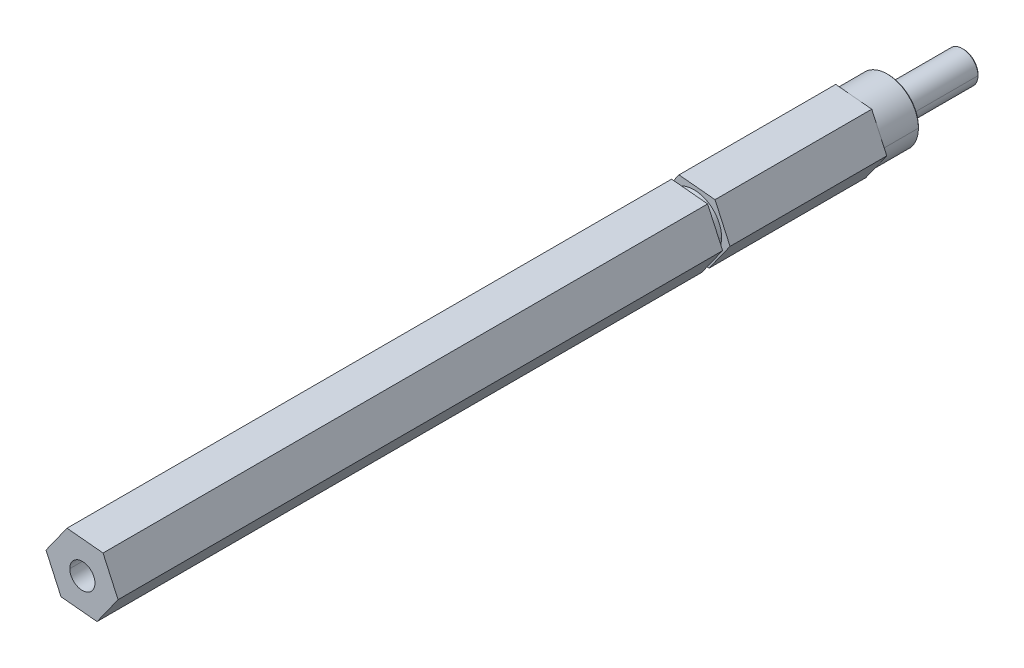
ISO-10303-21;
HEADER;
FILE_DESCRIPTION(('STEP AP214'),'2;1');
FILE_NAME('part.step','',(''),(''),'','','');
FILE_SCHEMA(('AUTOMOTIVE_DESIGN { 1 0 10303 214 1 1 1 1 }'));
ENDSEC;
DATA;
#1=APPLICATION_CONTEXT('core data for automotive mechanical design processes');
#2=APPLICATION_PROTOCOL_DEFINITION('international standard','automotive_design',2000,#1);
#3=PRODUCT_CONTEXT('',#1,'mechanical');
#4=PRODUCT('Part','Part','',(#3));
#5=PRODUCT_RELATED_PRODUCT_CATEGORY('part','',(#4));
#6=PRODUCT_DEFINITION_FORMATION('','',#4);
#7=PRODUCT_DEFINITION_CONTEXT('part definition',#1,'design');
#8=PRODUCT_DEFINITION('design','',#6,#7);
#9=PRODUCT_DEFINITION_SHAPE('','',#8);
#10=(LENGTH_UNIT() NAMED_UNIT(*) SI_UNIT(.MILLI.,.METRE.));
#11=(NAMED_UNIT(*) PLANE_ANGLE_UNIT() SI_UNIT($,.RADIAN.));
#12=(NAMED_UNIT(*) SI_UNIT($,.STERADIAN.) SOLID_ANGLE_UNIT());
#13=UNCERTAINTY_MEASURE_WITH_UNIT(LENGTH_MEASURE(1.E-05),#10,'distance_accuracy_value','');
#14=(GEOMETRIC_REPRESENTATION_CONTEXT(3) GLOBAL_UNCERTAINTY_ASSIGNED_CONTEXT((#13)) GLOBAL_UNIT_ASSIGNED_CONTEXT((#10,
#11,#12)) REPRESENTATION_CONTEXT('',''));
#15=CARTESIAN_POINT('',(0.,0.,0.));
#16=DIRECTION('',(0.,0.,1.));
#17=DIRECTION('',(1.,0.,0.));
#18=AXIS2_PLACEMENT_3D('',#15,#16,#17);
#19=CARTESIAN_POINT('',(0.0674577230356001,-0.148406990677699,122.4788));
#20=DIRECTION('',(0.,0.,1.));
#21=DIRECTION('',(1.,0.,0.));
#22=AXIS2_PLACEMENT_3D('',#19,#20,#21);
#23=CYLINDRICAL_SURFACE('',#22,2.5527);
#24=CARTESIAN_POINT('',(0.0674577230356001,-0.148406990677699,109.7788));
#25=DIRECTION('',(0.,0.,1.));
#26=DIRECTION('',(1.,0.,0.));
#27=AXIS2_PLACEMENT_3D('',#24,#25,#26);
#28=CIRCLE('',#27,2.5527);
#29=CARTESIAN_POINT('',(-2.4852422769644,-0.148406990677699,109.7788));
#30=VERTEX_POINT('',#29);
#31=CARTESIAN_POINT('',(2.6201577230356,-0.148406990677699,109.7788));
#32=VERTEX_POINT('',#31);
#33=EDGE_CURVE('E41',#30,#32,#28,.T.);
#34=ORIENTED_EDGE('',*,*,#33,.F.);
#35=DIRECTION('',(0.,0.,1.));
#36=VECTOR('',#35,1.);
#37=CARTESIAN_POINT('',(-2.4852422769644,-0.148406990677699,122.4788));
#38=LINE('',#37,#36);
#39=CARTESIAN_POINT('',(-2.4852422769644,-0.148406990677699,122.4788));
#40=VERTEX_POINT('',#39);
#41=EDGE_CURVE('E10',#30,#40,#38,.T.);
#42=ORIENTED_EDGE('',*,*,#41,.T.);
#43=CARTESIAN_POINT('',(0.0674577230356001,-0.148406990677699,122.4788));
#44=DIRECTION('',(0.,0.,1.));
#45=DIRECTION('',(1.,0.,0.));
#46=AXIS2_PLACEMENT_3D('',#43,#44,#45);
#47=CIRCLE('',#46,2.5527);
#48=CARTESIAN_POINT('',(2.6201577230356,-0.148406990677699,122.4788));
#49=VERTEX_POINT('',#48);
#50=EDGE_CURVE('E27',#40,#49,#47,.T.);
#51=ORIENTED_EDGE('',*,*,#50,.T.);
#52=DIRECTION('',(0.,0.,1.));
#53=VECTOR('',#52,1.);
#54=CARTESIAN_POINT('',(2.6201577230356,-0.148406990677699,122.4788));
#55=LINE('',#54,#53);
#56=EDGE_CURVE('E330',#32,#49,#55,.T.);
#57=ORIENTED_EDGE('',*,*,#56,.F.);
#58=EDGE_LOOP('',(#34,#42,#51,#57));
#59=FACE_BOUND('',#58,.T.);
#60=ADVANCED_FACE('F16',(#59),#23,.F.);
#61=CARTESIAN_POINT('',(0.0674577230356001,-0.148406990677699,109.7788));
#62=DIRECTION('',(0.,0.,1.));
#63=DIRECTION('',(1.,0.,0.));
#64=AXIS2_PLACEMENT_3D('',#61,#62,#63);
#65=CONICAL_SURFACE('',#64,2.5527,1.02974425867665);
#66=DIRECTION('',(0.857167300702112,0.,0.515038074910054));
#67=VECTOR('',#66,1.);
#68=CARTESIAN_POINT('',(2.6201577230356,-0.148406990677699,109.7788));
#69=LINE('',#68,#67);
#70=CARTESIAN_POINT('',(0.0674577230355966,-0.148406990677699,108.244983097808));
#71=VERTEX_POINT('',#70);
#72=EDGE_CURVE('E20',#71,#32,#69,.T.);
#73=ORIENTED_EDGE('',*,*,#72,.F.);
#74=DIRECTION('',(-0.857167300702112,0.,0.515038074910054));
#75=VECTOR('',#74,1.);
#76=CARTESIAN_POINT('',(-2.4852422769644,-0.148406990677699,109.7788));
#77=LINE('',#76,#75);
#78=EDGE_CURVE('E373',#71,#30,#77,.T.);
#79=ORIENTED_EDGE('',*,*,#78,.T.);
#80=ORIENTED_EDGE('',*,*,#33,.T.);
#81=EDGE_LOOP('',(#73,#79,#80));
#82=FACE_BOUND('',#81,.T.);
#83=ADVANCED_FACE('F532',(#82),#65,.F.);
#84=CARTESIAN_POINT('',(0.,0.,-55.8546));
#85=DIRECTION('',(0.,0.,1.));
#86=DIRECTION('',(-1.,0.,0.));
#87=AXIS2_PLACEMENT_3D('',#84,#85,#86);
#88=CONICAL_SURFACE('',#87,3.175,0.78539816339745);
#89=CARTESIAN_POINT('',(0.,0.,-56.1086));
#90=DIRECTION('',(0.,0.,-1.));
#91=DIRECTION('',(-1.,0.,0.));
#92=AXIS2_PLACEMENT_3D('',#89,#90,#91);
#93=CIRCLE('',#92,2.921);
#94=CARTESIAN_POINT('',(2.921,0.,-56.1086));
#95=VERTEX_POINT('',#94);
#96=CARTESIAN_POINT('',(-2.921,0.,-56.1086));
#97=VERTEX_POINT('',#96);
#98=EDGE_CURVE('E289',#95,#97,#93,.T.);
#99=ORIENTED_EDGE('',*,*,#98,.F.);
#100=DIRECTION('',(0.707106781186549,0.,0.707106781186546));
#101=VECTOR('',#100,1.);
#102=CARTESIAN_POINT('',(3.175,0.,-55.8546));
#103=LINE('',#102,#101);
#104=CARTESIAN_POINT('',(3.175,0.,-55.8546));
#105=VERTEX_POINT('',#104);
#106=EDGE_CURVE('E405',#95,#105,#103,.T.);
#107=ORIENTED_EDGE('',*,*,#106,.T.);
#108=CARTESIAN_POINT('',(0.,0.,-55.8546));
#109=DIRECTION('',(0.,0.,-1.));
#110=DIRECTION('',(-1.,0.,0.));
#111=AXIS2_PLACEMENT_3D('',#108,#109,#110);
#112=CIRCLE('',#111,3.175);
#113=CARTESIAN_POINT('',(-3.175,0.,-55.8546));
#114=VERTEX_POINT('',#113);
#115=EDGE_CURVE('E337',#105,#114,#112,.T.);
#116=ORIENTED_EDGE('',*,*,#115,.T.);
#117=DIRECTION('',(-0.707106781186549,0.,0.707106781186546));
#118=VECTOR('',#117,1.);
#119=CARTESIAN_POINT('',(-3.175,0.,-55.8546));
#120=LINE('',#119,#118);
#121=EDGE_CURVE('E339',#97,#114,#120,.T.);
#122=ORIENTED_EDGE('',*,*,#121,.F.);
#123=EDGE_LOOP('',(#99,#107,#116,#122));
#124=FACE_BOUND('',#123,.T.);
#125=ADVANCED_FACE('F538',(#124),#88,.T.);
#126=CARTESIAN_POINT('',(0.,0.,-55.8546));
#127=DIRECTION('',(0.,0.,1.));
#128=DIRECTION('',(1.,0.,0.));
#129=AXIS2_PLACEMENT_3D('',#126,#127,#128);
#130=CYLINDRICAL_SURFACE('',#129,3.175);
#131=CARTESIAN_POINT('',(0.,0.,-55.8546));
#132=DIRECTION('',(0.,0.,-1.));
#133=DIRECTION('',(-1.,0.,0.));
#134=AXIS2_PLACEMENT_3D('',#131,#132,#133);
#135=CIRCLE('',#134,3.175);
#136=EDGE_CURVE('E288',#114,#105,#135,.T.);
#137=ORIENTED_EDGE('',*,*,#136,.F.);
#138=DIRECTION('',(0.,0.,1.));
#139=VECTOR('',#138,1.);
#140=CARTESIAN_POINT('',(-3.175,0.,-55.8546));
#141=LINE('',#140,#139);
#142=CARTESIAN_POINT('',(-3.175,0.,-40.8686));
#143=VERTEX_POINT('',#142);
#144=EDGE_CURVE('E294',#114,#143,#141,.T.);
#145=ORIENTED_EDGE('',*,*,#144,.T.);
#146=CARTESIAN_POINT('',(0.,0.,-40.8686));
#147=DIRECTION('',(0.,0.,-1.));
#148=DIRECTION('',(-1.,0.,0.));
#149=AXIS2_PLACEMENT_3D('',#146,#147,#148);
#150=CIRCLE('',#149,3.175);
#151=CARTESIAN_POINT('',(3.175,0.,-40.8686));
#152=VERTEX_POINT('',#151);
#153=EDGE_CURVE('E290',#143,#152,#150,.T.);
#154=ORIENTED_EDGE('',*,*,#153,.T.);
#155=DIRECTION('',(0.,0.,1.));
#156=VECTOR('',#155,1.);
#157=CARTESIAN_POINT('',(3.175,0.,-55.8546));
#158=LINE('',#157,#156);
#159=EDGE_CURVE('E314',#105,#152,#158,.T.);
#160=ORIENTED_EDGE('',*,*,#159,.F.);
#161=EDGE_LOOP('',(#137,#145,#154,#160));
#162=FACE_BOUND('',#161,.T.);
#163=ADVANCED_FACE('F589',(#162),#130,.T.);
#164=CARTESIAN_POINT('',(0.,0.,-40.6146));
#165=DIRECTION('',(0.,0.,1.));
#166=DIRECTION('',(-1.,0.,0.));
#167=AXIS2_PLACEMENT_3D('',#164,#165,#166);
#168=CONICAL_SURFACE('',#167,6.34365,0.78539816339745);
#169=CARTESIAN_POINT('',(0.,0.,-40.8686));
#170=DIRECTION('',(0.,0.,-1.));
#171=DIRECTION('',(-1.,0.,0.));
#172=AXIS2_PLACEMENT_3D('',#169,#170,#171);
#173=CIRCLE('',#172,6.08965);
#174=CARTESIAN_POINT('',(6.08965,0.,-40.8686));
#175=VERTEX_POINT('',#174);
#176=CARTESIAN_POINT('',(-6.08965,0.,-40.8686));
#177=VERTEX_POINT('',#176);
#178=EDGE_CURVE('E364',#175,#177,#173,.T.);
#179=ORIENTED_EDGE('',*,*,#178,.F.);
#180=DIRECTION('',(0.707106781186549,0.,0.707106781186546));
#181=VECTOR('',#180,1.);
#182=CARTESIAN_POINT('',(6.34365,0.,-40.6146));
#183=LINE('',#182,#181);
#184=CARTESIAN_POINT('',(6.34365,0.,-40.6146));
#185=VERTEX_POINT('',#184);
#186=EDGE_CURVE('E295',#175,#185,#183,.T.);
#187=ORIENTED_EDGE('',*,*,#186,.T.);
#188=CARTESIAN_POINT('',(0.,0.,-40.6146));
#189=DIRECTION('',(0.,0.,-1.));
#190=DIRECTION('',(-1.,0.,0.));
#191=AXIS2_PLACEMENT_3D('',#188,#189,#190);
#192=CIRCLE('',#191,6.34365);
#193=CARTESIAN_POINT('',(-6.34365,0.,-40.6146));
#194=VERTEX_POINT('',#193);
#195=EDGE_CURVE('E381',#185,#194,#192,.T.);
#196=ORIENTED_EDGE('',*,*,#195,.T.);
#197=DIRECTION('',(-0.707106781186549,0.,0.707106781186546));
#198=VECTOR('',#197,1.);
#199=CARTESIAN_POINT('',(-6.34365,0.,-40.6146));
#200=LINE('',#199,#198);
#201=EDGE_CURVE('E313',#177,#194,#200,.T.);
#202=ORIENTED_EDGE('',*,*,#201,.F.);
#203=EDGE_LOOP('',(#179,#187,#196,#202));
#204=FACE_BOUND('',#203,.T.);
#205=ADVANCED_FACE('F503',(#204),#168,.T.);
#206=CARTESIAN_POINT('',(0.,0.,-40.6146));
#207=DIRECTION('',(0.,0.,1.));
#208=DIRECTION('',(1.,0.,0.));
#209=AXIS2_PLACEMENT_3D('',#206,#207,#208);
#210=CYLINDRICAL_SURFACE('',#209,6.34365);
#211=CARTESIAN_POINT('',(0.,0.,-40.6146));
#212=DIRECTION('',(0.,0.,-1.));
#213=DIRECTION('',(-1.,0.,0.));
#214=AXIS2_PLACEMENT_3D('',#211,#212,#213);
#215=CIRCLE('',#214,6.34365);
#216=EDGE_CURVE('E310',#194,#185,#215,.T.);
#217=ORIENTED_EDGE('',*,*,#216,.F.);
#218=DIRECTION('',(0.,0.,1.));
#219=VECTOR('',#218,1.);
#220=CARTESIAN_POINT('',(-6.34365,0.,-40.6146));
#221=LINE('',#220,#219);
#222=CARTESIAN_POINT('',(-6.34365,0.,-33.2486));
#223=VERTEX_POINT('',#222);
#224=EDGE_CURVE('E385',#194,#223,#221,.T.);
#225=ORIENTED_EDGE('',*,*,#224,.T.);
#226=CARTESIAN_POINT('',(0.,0.,-33.2486));
#227=DIRECTION('',(0.,0.,-1.));
#228=DIRECTION('',(-1.,0.,0.));
#229=AXIS2_PLACEMENT_3D('',#226,#227,#228);
#230=CIRCLE('',#229,6.34365);
#231=CARTESIAN_POINT('',(6.34365,0.,-33.2486));
#232=VERTEX_POINT('',#231);
#233=EDGE_CURVE('E317',#223,#232,#230,.T.);
#234=ORIENTED_EDGE('',*,*,#233,.T.);
#235=DIRECTION('',(0.,0.,1.));
#236=VECTOR('',#235,1.);
#237=CARTESIAN_POINT('',(6.34365,0.,-40.6146));
#238=LINE('',#237,#236);
#239=EDGE_CURVE('E398',#185,#232,#238,.T.);
#240=ORIENTED_EDGE('',*,*,#239,.F.);
#241=EDGE_LOOP('',(#217,#225,#234,#240));
#242=FACE_BOUND('',#241,.T.);
#243=ADVANCED_FACE('F509',(#242),#210,.T.);
#244=CARTESIAN_POINT('',(0.,0.,-1.4986));
#245=DIRECTION('',(0.,0.,1.));
#246=DIRECTION('',(1.,0.,0.));
#247=AXIS2_PLACEMENT_3D('',#244,#245,#246);
#248=CYLINDRICAL_SURFACE('',#247,5.588);
#249=CARTESIAN_POINT('',(0.,0.,-1.4986));
#250=DIRECTION('',(0.,0.,-1.));
#251=DIRECTION('',(-1.,0.,0.));
#252=AXIS2_PLACEMENT_3D('',#249,#250,#251);
#253=CIRCLE('',#252,5.588);
#254=CARTESIAN_POINT('',(-5.588,0.,-1.4986));
#255=VERTEX_POINT('',#254);
#256=CARTESIAN_POINT('',(5.588,0.,-1.4986));
#257=VERTEX_POINT('',#256);
#258=EDGE_CURVE('E242',#255,#257,#253,.T.);
#259=ORIENTED_EDGE('',*,*,#258,.F.);
#260=DIRECTION('',(0.,0.,1.));
#261=VECTOR('',#260,1.);
#262=CARTESIAN_POINT('',(-5.588,0.,-1.4986));
#263=LINE('',#262,#261);
#264=CARTESIAN_POINT('',(-5.588,0.,0.));
#265=VERTEX_POINT('',#264);
#266=EDGE_CURVE('E230',#255,#265,#263,.T.);
#267=ORIENTED_EDGE('',*,*,#266,.T.);
#268=CARTESIAN_POINT('',(0.,0.,0.));
#269=DIRECTION('',(0.,0.,-1.));
#270=DIRECTION('',(1.,0.,0.));
#271=AXIS2_PLACEMENT_3D('',#268,#269,#270);
#272=CIRCLE('',#271,5.588);
#273=CARTESIAN_POINT('',(5.588,0.,0.));
#274=VERTEX_POINT('',#273);
#275=EDGE_CURVE('E228',#265,#274,#272,.T.);
#276=ORIENTED_EDGE('',*,*,#275,.T.);
#277=DIRECTION('',(0.,0.,1.));
#278=VECTOR('',#277,1.);
#279=CARTESIAN_POINT('',(5.588,0.,-1.4986));
#280=LINE('',#279,#278);
#281=EDGE_CURVE('E214',#257,#274,#280,.T.);
#282=ORIENTED_EDGE('',*,*,#281,.F.);
#283=EDGE_LOOP('',(#259,#267,#276,#282));
#284=FACE_BOUND('',#283,.T.);
#285=ADVANCED_FACE('F229',(#284),#248,.T.);
#286=CARTESIAN_POINT('',(0.,0.,-40.8686));
#287=DIRECTION('',(0.,0.,-1.));
#288=DIRECTION('',(0.,-1.,0.));
#289=AXIS2_PLACEMENT_3D('',#286,#287,#288);
#290=PLANE('',#289);
#291=CARTESIAN_POINT('',(0.,0.,-40.8686));
#292=DIRECTION('',(0.,0.,-1.));
#293=DIRECTION('',(-1.,0.,0.));
#294=AXIS2_PLACEMENT_3D('',#291,#292,#293);
#295=CIRCLE('',#294,6.08965);
#296=EDGE_CURVE('E233',#177,#175,#295,.T.);
#297=ORIENTED_EDGE('',*,*,#296,.T.);
#298=ORIENTED_EDGE('',*,*,#178,.T.);
#299=EDGE_LOOP('',(#297,#298));
#300=FACE_BOUND('',#299,.T.);
#301=CARTESIAN_POINT('',(0.,0.,-40.8686));
#302=DIRECTION('',(0.,0.,-1.));
#303=DIRECTION('',(-1.,0.,0.));
#304=AXIS2_PLACEMENT_3D('',#301,#302,#303);
#305=CIRCLE('',#304,3.175);
#306=EDGE_CURVE('E410',#152,#143,#305,.T.);
#307=ORIENTED_EDGE('',*,*,#306,.F.);
#308=ORIENTED_EDGE('',*,*,#153,.F.);
#309=EDGE_LOOP('',(#307,#308));
#310=FACE_BOUND('',#309,.T.);
#311=ADVANCED_FACE('F516',(#300,#310),#290,.T.);
#312=CARTESIAN_POINT('',(-4.25703972350826,-5.97000386313159,-33.2486));
#313=DIRECTION('',(0.,0.,-1.));
#314=DIRECTION('',(0.,-1.,0.));
#315=AXIS2_PLACEMENT_3D('',#312,#313,#314);
#316=PLANE('',#315);
#317=DIRECTION('',(-0.995410263005907,0.0956995731574175,0.));
#318=VECTOR('',#317,1.);
#319=CARTESIAN_POINT('',(3.04165514440906,-6.67170647704343,-33.2486));
#320=LINE('',#319,#318);
#321=CARTESIAN_POINT('',(3.04165514440906,-6.67170647704343,-33.2486));
#322=VERTEX_POINT('',#321);
#323=CARTESIAN_POINT('',(-4.25703972350826,-5.97000386313159,-33.2486));
#324=VERTEX_POINT('',#323);
#325=EDGE_CURVE('E361',#322,#324,#320,.T.);
#326=ORIENTED_EDGE('',*,*,#325,.T.);
#327=DIRECTION('',(-0.414826870017303,0.909900361529573,0.));
#328=VECTOR('',#327,1.);
#329=CARTESIAN_POINT('',(-4.25703972350826,-5.97000386313159,-33.2486));
#330=LINE('',#329,#328);
#331=CARTESIAN_POINT('',(-7.29869486791732,0.701702613911844,-33.2486));
#332=VERTEX_POINT('',#331);
#333=EDGE_CURVE('E263',#324,#332,#330,.T.);
#334=ORIENTED_EDGE('',*,*,#333,.T.);
#335=DIRECTION('',(0.580583392988604,0.814200788372156,0.));
#336=VECTOR('',#335,1.);
#337=CARTESIAN_POINT('',(-7.29869486791732,0.701702613911844,-33.2486));
#338=LINE('',#337,#336);
#339=CARTESIAN_POINT('',(-3.04165514440906,6.67170647704343,-33.2486));
#340=VERTEX_POINT('',#339);
#341=EDGE_CURVE('E259',#332,#340,#338,.T.);
#342=ORIENTED_EDGE('',*,*,#341,.T.);
#343=DIRECTION('',(0.995410263005907,-0.0956995731574173,0.));
#344=VECTOR('',#343,1.);
#345=CARTESIAN_POINT('',(-3.04165514440906,6.67170647704343,-33.2486));
#346=LINE('',#345,#344);
#347=CARTESIAN_POINT('',(4.25703972350826,5.97000386313159,-33.2486));
#348=VERTEX_POINT('',#347);
#349=EDGE_CURVE('E264',#340,#348,#346,.T.);
#350=ORIENTED_EDGE('',*,*,#349,.T.);
#351=DIRECTION('',(0.414826870017302,-0.909900361529573,0.));
#352=VECTOR('',#351,1.);
#353=CARTESIAN_POINT('',(4.25703972350826,5.97000386313159,-33.2486));
#354=LINE('',#353,#352);
#355=CARTESIAN_POINT('',(7.29869486791732,-0.701702613911844,-33.2486));
#356=VERTEX_POINT('',#355);
#357=EDGE_CURVE('E246',#348,#356,#354,.T.);
#358=ORIENTED_EDGE('',*,*,#357,.T.);
#359=DIRECTION('',(-0.580583392988604,-0.814200788372156,0.));
#360=VECTOR('',#359,1.);
#361=CARTESIAN_POINT('',(7.29869486791732,-0.701702613911844,-33.2486));
#362=LINE('',#361,#360);
#363=EDGE_CURVE('E318',#356,#322,#362,.T.);
#364=ORIENTED_EDGE('',*,*,#363,.T.);
#365=EDGE_LOOP('',(#326,#334,#342,#350,#358,#364));
#366=FACE_BOUND('',#365,.T.);
#367=CARTESIAN_POINT('',(0.,0.,-33.2486));
#368=DIRECTION('',(0.,0.,-1.));
#369=DIRECTION('',(-1.,0.,0.));
#370=AXIS2_PLACEMENT_3D('',#367,#368,#369);
#371=CIRCLE('',#370,6.34365);
#372=EDGE_CURVE('E372',#232,#223,#371,.T.);
#373=ORIENTED_EDGE('',*,*,#372,.F.);
#374=ORIENTED_EDGE('',*,*,#233,.F.);
#375=EDGE_LOOP('',(#373,#374));
#376=FACE_BOUND('',#375,.T.);
#377=ADVANCED_FACE('F514',(#366,#376),#316,.T.);
#378=CARTESIAN_POINT('',(3.04165514440912,-6.6717064770434,0.));
#379=DIRECTION('',(0.,0.,1.));
#380=DIRECTION('',(1.,0.,0.));
#381=AXIS2_PLACEMENT_3D('',#378,#379,#380);
#382=PLANE('',#381);
#383=DIRECTION('',(0.995410263005907,-0.0956995731574093,0.));
#384=VECTOR('',#383,1.);
#385=CARTESIAN_POINT('',(-4.25703972350822,-5.97000386313162,0.));
#386=LINE('',#385,#384);
#387=CARTESIAN_POINT('',(-4.25703972350822,-5.97000386313162,0.));
#388=VERTEX_POINT('',#387);
#389=CARTESIAN_POINT('',(3.04165514440912,-6.67170647704341,0.));
#390=VERTEX_POINT('',#389);
#391=EDGE_CURVE('E321',#388,#390,#386,.T.);
#392=ORIENTED_EDGE('',*,*,#391,.F.);
#393=DIRECTION('',(0.41482687001731,-0.90990036152957,0.));
#394=VECTOR('',#393,1.);
#395=CARTESIAN_POINT('',(-7.29869486791733,0.701702613911784,0.));
#396=LINE('',#395,#394);
#397=CARTESIAN_POINT('',(-7.29869486791733,0.701702613911784,0.));
#398=VERTEX_POINT('',#397);
#399=EDGE_CURVE('E270',#398,#388,#396,.T.);
#400=ORIENTED_EDGE('',*,*,#399,.F.);
#401=DIRECTION('',(-0.580583392988597,-0.814200788372161,0.));
#402=VECTOR('',#401,1.);
#403=CARTESIAN_POINT('',(-3.04165514440912,6.6717064770434,0.));
#404=LINE('',#403,#402);
#405=CARTESIAN_POINT('',(-3.04165514440912,6.6717064770434,0.));
#406=VERTEX_POINT('',#405);
#407=EDGE_CURVE('E269',#406,#398,#404,.T.);
#408=ORIENTED_EDGE('',*,*,#407,.F.);
#409=DIRECTION('',(-0.995410263005907,0.0956995731574093,0.));
#410=VECTOR('',#409,1.);
#411=CARTESIAN_POINT('',(4.25703972350821,5.97000386313162,0.));
#412=LINE('',#411,#410);
#413=CARTESIAN_POINT('',(4.25703972350821,5.97000386313162,0.));
#414=VERTEX_POINT('',#413);
#415=EDGE_CURVE('E325',#414,#406,#412,.T.);
#416=ORIENTED_EDGE('',*,*,#415,.F.);
#417=DIRECTION('',(-0.41482687001731,0.90990036152957,0.));
#418=VECTOR('',#417,1.);
#419=CARTESIAN_POINT('',(7.29869486791733,-0.701702613911784,0.));
#420=LINE('',#419,#418);
#421=CARTESIAN_POINT('',(7.29869486791733,-0.701702613911784,0.));
#422=VERTEX_POINT('',#421);
#423=EDGE_CURVE('E300',#422,#414,#420,.T.);
#424=ORIENTED_EDGE('',*,*,#423,.F.);
#425=DIRECTION('',(0.580583392988597,0.814200788372161,0.));
#426=VECTOR('',#425,1.);
#427=CARTESIAN_POINT('',(3.04165514440912,-6.67170647704341,0.));
#428=LINE('',#427,#426);
#429=EDGE_CURVE('E168',#390,#422,#428,.T.);
#430=ORIENTED_EDGE('',*,*,#429,.F.);
#431=EDGE_LOOP('',(#392,#400,#408,#416,#424,#430));
#432=FACE_BOUND('',#431,.T.);
#433=CARTESIAN_POINT('',(0.,0.,0.));
#434=DIRECTION('',(0.,0.,-1.));
#435=DIRECTION('',(1.,0.,0.));
#436=AXIS2_PLACEMENT_3D('',#433,#434,#435);
#437=CIRCLE('',#436,5.588);
#438=EDGE_CURVE('E219',#274,#265,#437,.T.);
#439=ORIENTED_EDGE('',*,*,#438,.F.);
#440=ORIENTED_EDGE('',*,*,#275,.F.);
#441=EDGE_LOOP('',(#439,#440));
#442=FACE_BOUND('',#441,.T.);
#443=ADVANCED_FACE('F235',(#432,#442),#382,.F.);
#444=CARTESIAN_POINT('',(-4.25703972350822,-5.97000386313162,122.4788));
#445=DIRECTION('',(0.0956995731574093,0.995410263005907,0.));
#446=DIRECTION('',(0.,0.,-1.));
#447=AXIS2_PLACEMENT_3D('',#444,#445,#446);
#448=PLANE('',#447);
#449=ORIENTED_EDGE('',*,*,#391,.T.);
#450=DIRECTION('',(0.,0.,-1.));
#451=VECTOR('',#450,1.);
#452=CARTESIAN_POINT('',(3.04165514440912,-6.67170647704341,122.4788));
#453=LINE('',#452,#451);
#454=CARTESIAN_POINT('',(3.04165514440912,-6.67170647704341,122.4788));
#455=VERTEX_POINT('',#454);
#456=EDGE_CURVE('E296',#455,#390,#453,.T.);
#457=ORIENTED_EDGE('',*,*,#456,.F.);
#458=DIRECTION('',(0.995410263005907,-0.0956995731574093,0.));
#459=VECTOR('',#458,1.);
#460=CARTESIAN_POINT('',(-4.25703972350822,-5.97000386313162,122.4788));
#461=LINE('',#460,#459);
#462=CARTESIAN_POINT('',(-4.25703972350822,-5.97000386313162,122.4788));
#463=VERTEX_POINT('',#462);
#464=EDGE_CURVE('E154',#463,#455,#461,.T.);
#465=ORIENTED_EDGE('',*,*,#464,.F.);
#466=DIRECTION('',(0.,0.,-1.));
#467=VECTOR('',#466,1.);
#468=CARTESIAN_POINT('',(-4.25703972350822,-5.97000386313162,122.4788));
#469=LINE('',#468,#467);
#470=EDGE_CURVE('E346',#463,#388,#469,.T.);
#471=ORIENTED_EDGE('',*,*,#470,.T.);
#472=EDGE_LOOP('',(#449,#457,#465,#471));
#473=FACE_BOUND('',#472,.T.);
#474=ADVANCED_FACE('F525',(#473),#448,.F.);
#475=CARTESIAN_POINT('',(3.04165514440912,-6.67170647704341,122.4788));
#476=DIRECTION('',(-0.814200788372161,0.580583392988597,0.));
#477=DIRECTION('',(0.,0.,1.));
#478=AXIS2_PLACEMENT_3D('',#475,#476,#477);
#479=PLANE('',#478);
#480=ORIENTED_EDGE('',*,*,#429,.T.);
#481=DIRECTION('',(0.,0.,-1.));
#482=VECTOR('',#481,1.);
#483=CARTESIAN_POINT('',(7.29869486791733,-0.701702613911784,122.4788));
#484=LINE('',#483,#482);
#485=CARTESIAN_POINT('',(7.29869486791733,-0.701702613911784,122.4788));
#486=VERTEX_POINT('',#485);
#487=EDGE_CURVE('E304',#486,#422,#484,.T.);
#488=ORIENTED_EDGE('',*,*,#487,.F.);
#489=DIRECTION('',(0.580583392988597,0.814200788372161,0.));
#490=VECTOR('',#489,1.);
#491=CARTESIAN_POINT('',(3.04165514440912,-6.67170647704341,122.4788));
#492=LINE('',#491,#490);
#493=EDGE_CURVE('E271',#455,#486,#492,.T.);
#494=ORIENTED_EDGE('',*,*,#493,.F.);
#495=ORIENTED_EDGE('',*,*,#456,.T.);
#496=EDGE_LOOP('',(#480,#488,#494,#495));
#497=FACE_BOUND('',#496,.T.);
#498=ADVANCED_FACE('F563',(#497),#479,.F.);
#499=CARTESIAN_POINT('',(7.29869486791733,-0.701702613911784,122.4788));
#500=DIRECTION('',(-0.90990036152957,-0.41482687001731,0.));
#501=DIRECTION('',(-0.41482687001731,0.90990036152957,0.));
#502=AXIS2_PLACEMENT_3D('',#499,#500,#501);
#503=PLANE('',#502);
#504=ORIENTED_EDGE('',*,*,#423,.T.);
#505=DIRECTION('',(0.,0.,-1.));
#506=VECTOR('',#505,1.);
#507=CARTESIAN_POINT('',(4.25703972350821,5.97000386313162,122.4788));
#508=LINE('',#507,#506);
#509=CARTESIAN_POINT('',(4.25703972350821,5.97000386313162,122.4788));
#510=VERTEX_POINT('',#509);
#511=EDGE_CURVE('E392',#510,#414,#508,.T.);
#512=ORIENTED_EDGE('',*,*,#511,.F.);
#513=DIRECTION('',(-0.41482687001731,0.90990036152957,0.));
#514=VECTOR('',#513,1.);
#515=CARTESIAN_POINT('',(7.29869486791733,-0.701702613911784,122.4788));
#516=LINE('',#515,#514);
#517=EDGE_CURVE('E274',#486,#510,#516,.T.);
#518=ORIENTED_EDGE('',*,*,#517,.F.);
#519=ORIENTED_EDGE('',*,*,#487,.T.);
#520=EDGE_LOOP('',(#504,#512,#518,#519));
#521=FACE_BOUND('',#520,.T.);
#522=ADVANCED_FACE('F554',(#521),#503,.F.);
#523=CARTESIAN_POINT('',(4.25703972350821,5.97000386313162,122.4788));
#524=DIRECTION('',(-0.0956995731574093,-0.995410263005907,0.));
#525=DIRECTION('',(-0.995410263005907,0.0956995731574093,0.));
#526=AXIS2_PLACEMENT_3D('',#523,#524,#525);
#527=PLANE('',#526);
#528=ORIENTED_EDGE('',*,*,#415,.T.);
#529=DIRECTION('',(0.,0.,-1.));
#530=VECTOR('',#529,1.);
#531=CARTESIAN_POINT('',(-3.04165514440912,6.6717064770434,122.4788));
#532=LINE('',#531,#530);
#533=CARTESIAN_POINT('',(-3.04165514440912,6.6717064770434,122.4788));
#534=VERTEX_POINT('',#533);
#535=EDGE_CURVE('E265',#534,#406,#532,.T.);
#536=ORIENTED_EDGE('',*,*,#535,.F.);
#537=DIRECTION('',(-0.995410263005907,0.0956995731574093,0.));
#538=VECTOR('',#537,1.);
#539=CARTESIAN_POINT('',(4.25703972350821,5.97000386313162,122.4788));
#540=LINE('',#539,#538);
#541=EDGE_CURVE('E283',#510,#534,#540,.T.);
#542=ORIENTED_EDGE('',*,*,#541,.F.);
#543=ORIENTED_EDGE('',*,*,#511,.T.);
#544=EDGE_LOOP('',(#528,#536,#542,#543));
#545=FACE_BOUND('',#544,.T.);
#546=ADVANCED_FACE('F550',(#545),#527,.F.);
#547=CARTESIAN_POINT('',(-3.04165514440912,6.6717064770434,122.4788));
#548=DIRECTION('',(0.814200788372161,-0.580583392988597,0.));
#549=DIRECTION('',(0.,0.,-1.));
#550=AXIS2_PLACEMENT_3D('',#547,#548,#549);
#551=PLANE('',#550);
#552=ORIENTED_EDGE('',*,*,#407,.T.);
#553=DIRECTION('',(0.,0.,-1.));
#554=VECTOR('',#553,1.);
#555=CARTESIAN_POINT('',(-7.29869486791733,0.701702613911784,122.4788));
#556=LINE('',#555,#554);
#557=CARTESIAN_POINT('',(-7.29869486791733,0.701702613911784,122.4788));
#558=VERTEX_POINT('',#557);
#559=EDGE_CURVE('E307',#558,#398,#556,.T.);
#560=ORIENTED_EDGE('',*,*,#559,.F.);
#561=DIRECTION('',(-0.580583392988597,-0.814200788372161,0.));
#562=VECTOR('',#561,1.);
#563=CARTESIAN_POINT('',(-3.04165514440912,6.6717064770434,122.4788));
#564=LINE('',#563,#562);
#565=EDGE_CURVE('E280',#534,#558,#564,.T.);
#566=ORIENTED_EDGE('',*,*,#565,.F.);
#567=ORIENTED_EDGE('',*,*,#535,.T.);
#568=EDGE_LOOP('',(#552,#560,#566,#567));
#569=FACE_BOUND('',#568,.T.);
#570=ADVANCED_FACE('F553',(#569),#551,.F.);
#571=CARTESIAN_POINT('',(-7.29869486791733,0.701702613911784,122.4788));
#572=DIRECTION('',(0.90990036152957,0.41482687001731,0.));
#573=DIRECTION('',(0.,0.,-1.));
#574=AXIS2_PLACEMENT_3D('',#571,#572,#573);
#575=PLANE('',#574);
#576=ORIENTED_EDGE('',*,*,#399,.T.);
#577=ORIENTED_EDGE('',*,*,#470,.F.);
#578=DIRECTION('',(0.41482687001731,-0.90990036152957,0.));
#579=VECTOR('',#578,1.);
#580=CARTESIAN_POINT('',(-7.29869486791733,0.701702613911784,122.4788));
#581=LINE('',#580,#579);
#582=EDGE_CURVE('E225',#558,#463,#581,.T.);
#583=ORIENTED_EDGE('',*,*,#582,.F.);
#584=ORIENTED_EDGE('',*,*,#559,.T.);
#585=EDGE_LOOP('',(#576,#577,#583,#584));
#586=FACE_BOUND('',#585,.T.);
#587=ADVANCED_FACE('F706',(#586),#575,.F.);
#588=CARTESIAN_POINT('',(3.04165514440912,-6.6717064770434,122.4788));
#589=DIRECTION('',(0.,0.,1.));
#590=DIRECTION('',(1.,0.,0.));
#591=AXIS2_PLACEMENT_3D('',#588,#589,#590);
#592=PLANE('',#591);
#593=ORIENTED_EDGE('',*,*,#464,.T.);
#594=ORIENTED_EDGE('',*,*,#493,.T.);
#595=ORIENTED_EDGE('',*,*,#517,.T.);
#596=ORIENTED_EDGE('',*,*,#541,.T.);
#597=ORIENTED_EDGE('',*,*,#565,.T.);
#598=ORIENTED_EDGE('',*,*,#582,.T.);
#599=EDGE_LOOP('',(#593,#594,#595,#596,#597,#598));
#600=FACE_BOUND('',#599,.T.);
#601=CARTESIAN_POINT('',(0.0674577230356001,-0.148406990677699,122.4788));
#602=DIRECTION('',(0.,0.,1.));
#603=DIRECTION('',(1.,0.,0.));
#604=AXIS2_PLACEMENT_3D('',#601,#602,#603);
#605=CIRCLE('',#604,2.5527);
#606=EDGE_CURVE('E326',#49,#40,#605,.T.);
#607=ORIENTED_EDGE('',*,*,#606,.F.);
#608=ORIENTED_EDGE('',*,*,#50,.F.);
#609=EDGE_LOOP('',(#607,#608));
#610=FACE_BOUND('',#609,.T.);
#611=ADVANCED_FACE('F581',(#600,#610),#592,.T.);
#612=CARTESIAN_POINT('',(0.,0.,-1.4986));
#613=DIRECTION('',(0.,0.,1.));
#614=DIRECTION('',(1.,0.,0.));
#615=AXIS2_PLACEMENT_3D('',#612,#613,#614);
#616=CYLINDRICAL_SURFACE('',#615,5.588);
#617=ORIENTED_EDGE('',*,*,#266,.F.);
#618=CARTESIAN_POINT('',(0.,0.,-1.4986));
#619=DIRECTION('',(0.,0.,-1.));
#620=DIRECTION('',(-1.,0.,0.));
#621=AXIS2_PLACEMENT_3D('',#618,#619,#620);
#622=CIRCLE('',#621,5.588);
#623=EDGE_CURVE('E221',#257,#255,#622,.T.);
#624=ORIENTED_EDGE('',*,*,#623,.F.);
#625=ORIENTED_EDGE('',*,*,#281,.T.);
#626=ORIENTED_EDGE('',*,*,#438,.T.);
#627=EDGE_LOOP('',(#617,#624,#625,#626));
#628=FACE_BOUND('',#627,.T.);
#629=ADVANCED_FACE('F217',(#628),#616,.T.);
#630=CARTESIAN_POINT('',(-4.25703972350826,-5.97000386313159,-1.4986));
#631=DIRECTION('',(0.,0.,-1.));
#632=DIRECTION('',(0.,-1.,0.));
#633=AXIS2_PLACEMENT_3D('',#630,#631,#632);
#634=PLANE('',#633);
#635=DIRECTION('',(-0.995410263005907,0.0956995731574175,0.));
#636=VECTOR('',#635,1.);
#637=CARTESIAN_POINT('',(3.04165514440906,-6.67170647704343,-1.4986));
#638=LINE('',#637,#636);
#639=CARTESIAN_POINT('',(3.04165514440906,-6.67170647704343,-1.4986));
#640=VERTEX_POINT('',#639);
#641=CARTESIAN_POINT('',(-4.25703972350826,-5.97000386313159,-1.4986));
#642=VERTEX_POINT('',#641);
#643=EDGE_CURVE('E355',#640,#642,#638,.T.);
#644=ORIENTED_EDGE('',*,*,#643,.F.);
#645=DIRECTION('',(-0.580583392988604,-0.814200788372156,0.));
#646=VECTOR('',#645,1.);
#647=CARTESIAN_POINT('',(7.29869486791732,-0.701702613911844,-1.4986));
#648=LINE('',#647,#646);
#649=CARTESIAN_POINT('',(7.29869486791732,-0.701702613911844,-1.4986));
#650=VERTEX_POINT('',#649);
#651=EDGE_CURVE('E414',#650,#640,#648,.T.);
#652=ORIENTED_EDGE('',*,*,#651,.F.);
#653=DIRECTION('',(0.414826870017302,-0.909900361529573,0.));
#654=VECTOR('',#653,1.);
#655=CARTESIAN_POINT('',(4.25703972350826,5.97000386313159,-1.4986));
#656=LINE('',#655,#654);
#657=CARTESIAN_POINT('',(4.25703972350826,5.97000386313159,-1.4986));
#658=VERTEX_POINT('',#657);
#659=EDGE_CURVE('E393',#658,#650,#656,.T.);
#660=ORIENTED_EDGE('',*,*,#659,.F.);
#661=DIRECTION('',(0.995410263005907,-0.0956995731574173,0.));
#662=VECTOR('',#661,1.);
#663=CARTESIAN_POINT('',(-3.04165514440906,6.67170647704343,-1.4986));
#664=LINE('',#663,#662);
#665=CARTESIAN_POINT('',(-3.04165514440906,6.67170647704343,-1.4986));
#666=VERTEX_POINT('',#665);
#667=EDGE_CURVE('E248',#666,#658,#664,.T.);
#668=ORIENTED_EDGE('',*,*,#667,.F.);
#669=DIRECTION('',(0.580583392988604,0.814200788372156,0.));
#670=VECTOR('',#669,1.);
#671=CARTESIAN_POINT('',(-7.29869486791732,0.701702613911844,-1.4986));
#672=LINE('',#671,#670);
#673=CARTESIAN_POINT('',(-7.29869486791732,0.701702613911844,-1.4986));
#674=VERTEX_POINT('',#673);
#675=EDGE_CURVE('E254',#674,#666,#672,.T.);
#676=ORIENTED_EDGE('',*,*,#675,.F.);
#677=DIRECTION('',(-0.414826870017303,0.909900361529573,0.));
#678=VECTOR('',#677,1.);
#679=CARTESIAN_POINT('',(-4.25703972350826,-5.97000386313159,-1.4986));
#680=LINE('',#679,#678);
#681=EDGE_CURVE('E275',#642,#674,#680,.T.);
#682=ORIENTED_EDGE('',*,*,#681,.F.);
#683=EDGE_LOOP('',(#644,#652,#660,#668,#676,#682));
#684=FACE_BOUND('',#683,.T.);
#685=ORIENTED_EDGE('',*,*,#623,.T.);
#686=ORIENTED_EDGE('',*,*,#258,.T.);
#687=EDGE_LOOP('',(#685,#686));
#688=FACE_BOUND('',#687,.T.);
#689=ADVANCED_FACE('F471',(#684,#688),#634,.F.);
#690=CARTESIAN_POINT('',(3.04165514440906,-6.67170647704343,-33.2486));
#691=DIRECTION('',(0.0956995731574175,0.995410263005907,0.));
#692=DIRECTION('',(0.,0.,-1.));
#693=AXIS2_PLACEMENT_3D('',#690,#691,#692);
#694=PLANE('',#693);
#695=ORIENTED_EDGE('',*,*,#643,.T.);
#696=DIRECTION('',(0.,0.,1.));
#697=VECTOR('',#696,1.);
#698=CARTESIAN_POINT('',(-4.25703972350826,-5.97000386313159,-33.2486));
#699=LINE('',#698,#697);
#700=EDGE_CURVE('E258',#324,#642,#699,.T.);
#701=ORIENTED_EDGE('',*,*,#700,.F.);
#702=ORIENTED_EDGE('',*,*,#325,.F.);
#703=DIRECTION('',(0.,0.,1.));
#704=VECTOR('',#703,1.);
#705=CARTESIAN_POINT('',(3.04165514440906,-6.67170647704343,-33.2486));
#706=LINE('',#705,#704);
#707=EDGE_CURVE('E279',#322,#640,#706,.T.);
#708=ORIENTED_EDGE('',*,*,#707,.T.);
#709=EDGE_LOOP('',(#695,#701,#702,#708));
#710=FACE_BOUND('',#709,.T.);
#711=ADVANCED_FACE('F474',(#710),#694,.F.);
#712=CARTESIAN_POINT('',(-4.25703972350826,-5.97000386313159,-33.2486));
#713=DIRECTION('',(0.909900361529573,0.414826870017303,0.));
#714=DIRECTION('',(0.,0.,-1.));
#715=AXIS2_PLACEMENT_3D('',#712,#713,#714);
#716=PLANE('',#715);
#717=ORIENTED_EDGE('',*,*,#681,.T.);
#718=DIRECTION('',(0.,0.,1.));
#719=VECTOR('',#718,1.);
#720=CARTESIAN_POINT('',(-7.29869486791732,0.701702613911844,-33.2486));
#721=LINE('',#720,#719);
#722=EDGE_CURVE('E252',#332,#674,#721,.T.);
#723=ORIENTED_EDGE('',*,*,#722,.F.);
#724=ORIENTED_EDGE('',*,*,#333,.F.);
#725=ORIENTED_EDGE('',*,*,#700,.T.);
#726=EDGE_LOOP('',(#717,#723,#724,#725));
#727=FACE_BOUND('',#726,.T.);
#728=ADVANCED_FACE('F467',(#727),#716,.F.);
#729=CARTESIAN_POINT('',(-7.29869486791732,0.701702613911844,-33.2486));
#730=DIRECTION('',(0.814200788372156,-0.580583392988604,0.));
#731=DIRECTION('',(0.,0.,-1.));
#732=AXIS2_PLACEMENT_3D('',#729,#730,#731);
#733=PLANE('',#732);
#734=ORIENTED_EDGE('',*,*,#675,.T.);
#735=DIRECTION('',(0.,0.,1.));
#736=VECTOR('',#735,1.);
#737=CARTESIAN_POINT('',(-3.04165514440906,6.67170647704343,-33.2486));
#738=LINE('',#737,#736);
#739=EDGE_CURVE('E253',#340,#666,#738,.T.);
#740=ORIENTED_EDGE('',*,*,#739,.F.);
#741=ORIENTED_EDGE('',*,*,#341,.F.);
#742=ORIENTED_EDGE('',*,*,#722,.T.);
#743=EDGE_LOOP('',(#734,#740,#741,#742));
#744=FACE_BOUND('',#743,.T.);
#745=ADVANCED_FACE('F462',(#744),#733,.F.);
#746=CARTESIAN_POINT('',(-3.04165514440906,6.67170647704343,-33.2486));
#747=DIRECTION('',(-0.0956995731574172,-0.995410263005907,0.));
#748=DIRECTION('',(-0.995410263005907,0.0956995731574172,0.));
#749=AXIS2_PLACEMENT_3D('',#746,#747,#748);
#750=PLANE('',#749);
#751=ORIENTED_EDGE('',*,*,#667,.T.);
#752=DIRECTION('',(0.,0.,1.));
#753=VECTOR('',#752,1.);
#754=CARTESIAN_POINT('',(4.25703972350826,5.97000386313159,-33.2486));
#755=LINE('',#754,#753);
#756=EDGE_CURVE('E397',#348,#658,#755,.T.);
#757=ORIENTED_EDGE('',*,*,#756,.F.);
#758=ORIENTED_EDGE('',*,*,#349,.F.);
#759=ORIENTED_EDGE('',*,*,#739,.T.);
#760=EDGE_LOOP('',(#751,#757,#758,#759));
#761=FACE_BOUND('',#760,.T.);
#762=ADVANCED_FACE('F543',(#761),#750,.F.);
#763=CARTESIAN_POINT('',(4.25703972350826,5.97000386313159,-33.2486));
#764=DIRECTION('',(-0.909900361529573,-0.414826870017302,0.));
#765=DIRECTION('',(-0.414826870017302,0.909900361529573,0.));
#766=AXIS2_PLACEMENT_3D('',#763,#764,#765);
#767=PLANE('',#766);
#768=ORIENTED_EDGE('',*,*,#659,.T.);
#769=DIRECTION('',(0.,0.,1.));
#770=VECTOR('',#769,1.);
#771=CARTESIAN_POINT('',(7.29869486791732,-0.701702613911844,-33.2486));
#772=LINE('',#771,#770);
#773=EDGE_CURVE('E401',#356,#650,#772,.T.);
#774=ORIENTED_EDGE('',*,*,#773,.F.);
#775=ORIENTED_EDGE('',*,*,#357,.F.);
#776=ORIENTED_EDGE('',*,*,#756,.T.);
#777=EDGE_LOOP('',(#768,#774,#775,#776));
#778=FACE_BOUND('',#777,.T.);
#779=ADVANCED_FACE('F484',(#778),#767,.F.);
#780=CARTESIAN_POINT('',(7.29869486791732,-0.701702613911844,-33.2486));
#781=DIRECTION('',(-0.814200788372156,0.580583392988604,0.));
#782=DIRECTION('',(0.,0.,1.));
#783=AXIS2_PLACEMENT_3D('',#780,#781,#782);
#784=PLANE('',#783);
#785=ORIENTED_EDGE('',*,*,#651,.T.);
#786=ORIENTED_EDGE('',*,*,#707,.F.);
#787=ORIENTED_EDGE('',*,*,#363,.F.);
#788=ORIENTED_EDGE('',*,*,#773,.T.);
#789=EDGE_LOOP('',(#785,#786,#787,#788));
#790=FACE_BOUND('',#789,.T.);
#791=ADVANCED_FACE('F478',(#790),#784,.F.);
#792=CARTESIAN_POINT('',(0.,0.,-40.6146));
#793=DIRECTION('',(0.,0.,1.));
#794=DIRECTION('',(1.,0.,0.));
#795=AXIS2_PLACEMENT_3D('',#792,#793,#794);
#796=CYLINDRICAL_SURFACE('',#795,6.34365);
#797=ORIENTED_EDGE('',*,*,#224,.F.);
#798=ORIENTED_EDGE('',*,*,#195,.F.);
#799=ORIENTED_EDGE('',*,*,#239,.T.);
#800=ORIENTED_EDGE('',*,*,#372,.T.);
#801=EDGE_LOOP('',(#797,#798,#799,#800));
#802=FACE_BOUND('',#801,.T.);
#803=ADVANCED_FACE('F512',(#802),#796,.T.);
#804=CARTESIAN_POINT('',(0.,0.,-40.6146));
#805=DIRECTION('',(0.,0.,1.));
#806=DIRECTION('',(-1.,0.,0.));
#807=AXIS2_PLACEMENT_3D('',#804,#805,#806);
#808=CONICAL_SURFACE('',#807,6.34365,0.78539816339745);
#809=ORIENTED_EDGE('',*,*,#186,.F.);
#810=ORIENTED_EDGE('',*,*,#296,.F.);
#811=ORIENTED_EDGE('',*,*,#201,.T.);
#812=ORIENTED_EDGE('',*,*,#216,.T.);
#813=EDGE_LOOP('',(#809,#810,#811,#812));
#814=FACE_BOUND('',#813,.T.);
#815=ADVANCED_FACE('F18',(#814),#808,.T.);
#816=CARTESIAN_POINT('',(0.,0.,-55.8546));
#817=DIRECTION('',(0.,0.,1.));
#818=DIRECTION('',(1.,0.,0.));
#819=AXIS2_PLACEMENT_3D('',#816,#817,#818);
#820=CYLINDRICAL_SURFACE('',#819,3.175);
#821=ORIENTED_EDGE('',*,*,#144,.F.);
#822=ORIENTED_EDGE('',*,*,#115,.F.);
#823=ORIENTED_EDGE('',*,*,#159,.T.);
#824=ORIENTED_EDGE('',*,*,#306,.T.);
#825=EDGE_LOOP('',(#821,#822,#823,#824));
#826=FACE_BOUND('',#825,.T.);
#827=ADVANCED_FACE('F571',(#826),#820,.T.);
#828=CARTESIAN_POINT('',(0.,0.,-55.8546));
#829=DIRECTION('',(0.,0.,1.));
#830=DIRECTION('',(-1.,0.,0.));
#831=AXIS2_PLACEMENT_3D('',#828,#829,#830);
#832=CONICAL_SURFACE('',#831,3.175,0.78539816339745);
#833=ORIENTED_EDGE('',*,*,#106,.F.);
#834=CARTESIAN_POINT('',(0.,0.,-56.1086));
#835=DIRECTION('',(0.,0.,-1.));
#836=DIRECTION('',(-1.,0.,0.));
#837=AXIS2_PLACEMENT_3D('',#834,#835,#836);
#838=CIRCLE('',#837,2.921);
#839=EDGE_CURVE('E284',#97,#95,#838,.T.);
#840=ORIENTED_EDGE('',*,*,#839,.F.);
#841=ORIENTED_EDGE('',*,*,#121,.T.);
#842=ORIENTED_EDGE('',*,*,#136,.T.);
#843=EDGE_LOOP('',(#833,#840,#841,#842));
#844=FACE_BOUND('',#843,.T.);
#845=ADVANCED_FACE('F568',(#844),#832,.T.);
#846=CARTESIAN_POINT('',(0.,0.,-56.1086));
#847=DIRECTION('',(0.,0.,-1.));
#848=DIRECTION('',(0.,-1.,0.));
#849=AXIS2_PLACEMENT_3D('',#846,#847,#848);
#850=PLANE('',#849);
#851=ORIENTED_EDGE('',*,*,#839,.T.);
#852=ORIENTED_EDGE('',*,*,#98,.T.);
#853=EDGE_LOOP('',(#851,#852));
#854=FACE_BOUND('',#853,.T.);
#855=ADVANCED_FACE('F548',(#854),#850,.T.);
#856=CARTESIAN_POINT('',(0.0674577230356001,-0.148406990677699,109.7788));
#857=DIRECTION('',(0.,0.,1.));
#858=DIRECTION('',(1.,0.,0.));
#859=AXIS2_PLACEMENT_3D('',#856,#857,#858);
#860=CONICAL_SURFACE('',#859,2.5527,1.02974425867665);
#861=ORIENTED_EDGE('',*,*,#78,.F.);
#862=ORIENTED_EDGE('',*,*,#72,.T.);
#863=CARTESIAN_POINT('',(0.0674577230356001,-0.148406990677699,109.7788));
#864=DIRECTION('',(0.,0.,1.));
#865=DIRECTION('',(1.,0.,0.));
#866=AXIS2_PLACEMENT_3D('',#863,#864,#865);
#867=CIRCLE('',#866,2.5527);
#868=EDGE_CURVE('E431',#32,#30,#867,.T.);
#869=ORIENTED_EDGE('',*,*,#868,.T.);
#870=EDGE_LOOP('',(#861,#862,#869));
#871=FACE_BOUND('',#870,.T.);
#872=ADVANCED_FACE('F544',(#871),#860,.F.);
#873=CARTESIAN_POINT('',(0.0674577230356001,-0.148406990677699,122.4788));
#874=DIRECTION('',(0.,0.,1.));
#875=DIRECTION('',(1.,0.,0.));
#876=AXIS2_PLACEMENT_3D('',#873,#874,#875);
#877=CYLINDRICAL_SURFACE('',#876,2.5527);
#878=ORIENTED_EDGE('',*,*,#41,.F.);
#879=ORIENTED_EDGE('',*,*,#868,.F.);
#880=ORIENTED_EDGE('',*,*,#56,.T.);
#881=ORIENTED_EDGE('',*,*,#606,.T.);
#882=EDGE_LOOP('',(#878,#879,#880,#881));
#883=FACE_BOUND('',#882,.T.);
#884=ADVANCED_FACE('F547',(#883),#877,.F.);
#885=CLOSED_SHELL('',(#60,#83,#125,#163,#205,#243,#285,#311,#377,#443,#474,#498,#522,#546,#570,
#587,#611,#629,#689,#711,#728,#745,#762,#779,#791,#803,#815,#827,#845,#855,#872,#884));
#886=MANIFOLD_SOLID_BREP('B1',#885);
#887=ADVANCED_BREP_SHAPE_REPRESENTATION('',(#18,#886),#14);
#888=SHAPE_DEFINITION_REPRESENTATION(#9,#887);
ENDSEC;
END-ISO-10303-21;
